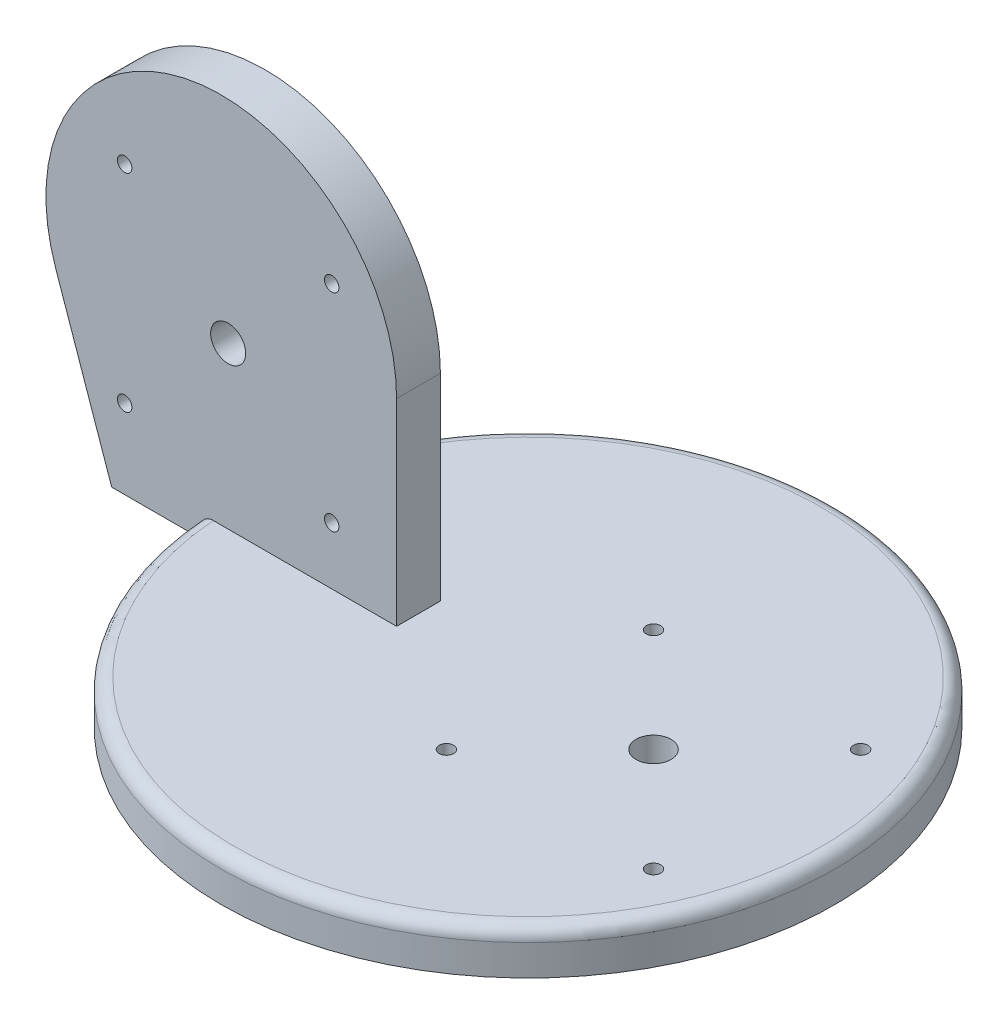
ISO-10303-21;
HEADER;
FILE_DESCRIPTION(('STEP AP214'),'2;1');
FILE_NAME('part.step','',(''),(''),'','','');
FILE_SCHEMA(('AUTOMOTIVE_DESIGN { 1 0 10303 214 1 1 1 1 }'));
ENDSEC;
DATA;
#1=APPLICATION_CONTEXT('core data for automotive mechanical design processes');
#2=APPLICATION_PROTOCOL_DEFINITION('international standard','automotive_design',2000,#1);
#3=PRODUCT_CONTEXT('',#1,'mechanical');
#4=PRODUCT('Part','Part','',(#3));
#5=PRODUCT_RELATED_PRODUCT_CATEGORY('part','',(#4));
#6=PRODUCT_DEFINITION_FORMATION('','',#4);
#7=PRODUCT_DEFINITION_CONTEXT('part definition',#1,'design');
#8=PRODUCT_DEFINITION('design','',#6,#7);
#9=PRODUCT_DEFINITION_SHAPE('','',#8);
#10=(LENGTH_UNIT() NAMED_UNIT(*) SI_UNIT(.MILLI.,.METRE.));
#11=(NAMED_UNIT(*) PLANE_ANGLE_UNIT() SI_UNIT($,.RADIAN.));
#12=(NAMED_UNIT(*) SI_UNIT($,.STERADIAN.) SOLID_ANGLE_UNIT());
#13=UNCERTAINTY_MEASURE_WITH_UNIT(LENGTH_MEASURE(1.E-05),#10,'distance_accuracy_value','');
#14=(GEOMETRIC_REPRESENTATION_CONTEXT(3) GLOBAL_UNCERTAINTY_ASSIGNED_CONTEXT((#13)) GLOBAL_UNIT_ASSIGNED_CONTEXT((#10,
#11,#12)) REPRESENTATION_CONTEXT('',''));
#15=CARTESIAN_POINT('',(0.,0.,0.));
#16=DIRECTION('',(0.,0.,1.));
#17=DIRECTION('',(1.,0.,0.));
#18=AXIS2_PLACEMENT_3D('',#15,#16,#17);
#19=CARTESIAN_POINT('',(0.,10.,0.));
#20=DIRECTION('',(0.,-1.,0.));
#21=DIRECTION('',(0.,0.,-1.));
#22=AXIS2_PLACEMENT_3D('',#19,#20,#21);
#23=CYLINDRICAL_SURFACE('',#22,70.);
#24=CARTESIAN_POINT('',(0.,0.,0.));
#25=DIRECTION('',(0.,1.,0.));
#26=DIRECTION('',(0.,0.,1.));
#27=AXIS2_PLACEMENT_3D('',#24,#25,#26);
#28=CIRCLE('',#27,70.);
#29=CARTESIAN_POINT('',(0.,0.,70.));
#30=VERTEX_POINT('',#29);
#31=EDGE_CURVE('E223',#30,#30,#28,.T.);
#32=ORIENTED_EDGE('',*,*,#31,.T.);
#33=EDGE_LOOP('',(#32));
#34=FACE_BOUND('',#33,.T.);
#35=DIRECTION('',(0.,-1.,0.));
#36=VECTOR('',#35,1.);
#37=CARTESIAN_POINT('',(-69.8212002188447,10.,-5.));
#38=LINE('',#37,#36);
#39=CARTESIAN_POINT('',(-69.8212002188447,4.99999999999999,-5.));
#40=VERTEX_POINT('',#39);
#41=CARTESIAN_POINT('',(-69.8212002188447,7.,-5.));
#42=VERTEX_POINT('',#41);
#43=EDGE_CURVE('E216',#40,#42,#38,.F.);
#44=ORIENTED_EDGE('',*,*,#43,.T.);
#45=CARTESIAN_POINT('',(0.,7.,0.));
#46=DIRECTION('',(0.,1.,0.));
#47=DIRECTION('',(0.,0.,1.));
#48=AXIS2_PLACEMENT_3D('',#45,#46,#47);
#49=CIRCLE('',#48,70.);
#50=CARTESIAN_POINT('',(-69.8212002188447,7.,5.));
#51=VERTEX_POINT('',#50);
#52=EDGE_CURVE('E63',#42,#51,#49,.F.);
#53=ORIENTED_EDGE('',*,*,#52,.T.);
#54=DIRECTION('',(0.,-1.,0.));
#55=VECTOR('',#54,1.);
#56=CARTESIAN_POINT('',(-69.8212002188447,10.,5.));
#57=LINE('',#56,#55);
#58=CARTESIAN_POINT('',(-69.8212002188447,4.99999999999999,5.));
#59=VERTEX_POINT('',#58);
#60=EDGE_CURVE('E218',#59,#51,#57,.F.);
#61=ORIENTED_EDGE('',*,*,#60,.F.);
#62=CARTESIAN_POINT('',(0.,5.,0.));
#63=DIRECTION('',(0.,1.,0.));
#64=DIRECTION('',(-1.,0.,0.));
#65=AXIS2_PLACEMENT_3D('',#62,#63,#64);
#66=CIRCLE('',#65,70.);
#67=EDGE_CURVE('E236',#40,#59,#66,.T.);
#68=ORIENTED_EDGE('',*,*,#67,.F.);
#69=EDGE_LOOP('',(#44,#53,#61,#68));
#70=FACE_BOUND('',#69,.T.);
#71=ADVANCED_FACE('F36',(#34,#70),#23,.T.);
#72=CARTESIAN_POINT('',(0.,10.,0.));
#73=DIRECTION('',(0.,1.,0.));
#74=DIRECTION('',(0.,0.,1.));
#75=AXIS2_PLACEMENT_3D('',#72,#73,#74);
#76=PLANE('',#75);
#77=CARTESIAN_POINT('',(28.624,10.,0.00199999999999853));
#78=DIRECTION('',(0.,1.,0.));
#79=DIRECTION('',(0.,0.,1.));
#80=AXIS2_PLACEMENT_3D('',#77,#78,#79);
#81=CIRCLE('',#80,3.99999999999999);
#82=CARTESIAN_POINT('',(28.624,10.,4.00199999999999));
#83=VERTEX_POINT('',#82);
#84=EDGE_CURVE('E611',#83,#83,#81,.T.);
#85=ORIENTED_EDGE('',*,*,#84,.F.);
#86=EDGE_LOOP('',(#85));
#87=FACE_BOUND('',#86,.T.);
#88=CARTESIAN_POINT('',(5.,10.,-23.622));
#89=DIRECTION('',(0.,1.,0.));
#90=DIRECTION('',(0.,0.,1.));
#91=AXIS2_PLACEMENT_3D('',#88,#89,#90);
#92=CIRCLE('',#91,1.64999999999999);
#93=CARTESIAN_POINT('',(5.,10.,-21.972));
#94=VERTEX_POINT('',#93);
#95=EDGE_CURVE('E163',#94,#94,#92,.T.);
#96=ORIENTED_EDGE('',*,*,#95,.F.);
#97=EDGE_LOOP('',(#96));
#98=FACE_BOUND('',#97,.T.);
#99=CARTESIAN_POINT('',(52.244,10.,-23.622));
#100=DIRECTION('',(0.,1.,0.));
#101=DIRECTION('',(0.,0.,1.));
#102=AXIS2_PLACEMENT_3D('',#99,#100,#101);
#103=CIRCLE('',#102,1.64999999999999);
#104=CARTESIAN_POINT('',(52.244,10.,-21.972));
#105=VERTEX_POINT('',#104);
#106=EDGE_CURVE('E169',#105,#105,#103,.T.);
#107=ORIENTED_EDGE('',*,*,#106,.F.);
#108=EDGE_LOOP('',(#107));
#109=FACE_BOUND('',#108,.T.);
#110=CARTESIAN_POINT('',(52.244,10.,23.622));
#111=DIRECTION('',(0.,1.,0.));
#112=DIRECTION('',(0.,0.,1.));
#113=AXIS2_PLACEMENT_3D('',#110,#111,#112);
#114=CIRCLE('',#113,1.64999999999999);
#115=CARTESIAN_POINT('',(52.244,10.,25.272));
#116=VERTEX_POINT('',#115);
#117=EDGE_CURVE('E175',#116,#116,#114,.T.);
#118=ORIENTED_EDGE('',*,*,#117,.F.);
#119=EDGE_LOOP('',(#118));
#120=FACE_BOUND('',#119,.T.);
#121=CARTESIAN_POINT('',(5.,10.,23.622));
#122=DIRECTION('',(0.,1.,0.));
#123=DIRECTION('',(0.,0.,1.));
#124=AXIS2_PLACEMENT_3D('',#121,#122,#123);
#125=CIRCLE('',#124,1.64999999999999);
#126=CARTESIAN_POINT('',(5.,10.,25.272));
#127=VERTEX_POINT('',#126);
#128=EDGE_CURVE('E181',#127,#127,#125,.T.);
#129=ORIENTED_EDGE('',*,*,#128,.F.);
#130=EDGE_LOOP('',(#129));
#131=FACE_BOUND('',#130,.T.);
#132=DIRECTION('',(-1.,0.,0.));
#133=VECTOR('',#132,1.);
#134=CARTESIAN_POINT('',(0.,10.,5.));
#135=LINE('',#134,#133);
#136=CARTESIAN_POINT('',(-25.,10.,5.));
#137=VERTEX_POINT('',#136);
#138=CARTESIAN_POINT('',(-66.8131723539603,10.,5.));
#139=VERTEX_POINT('',#138);
#140=EDGE_CURVE('E233',#137,#139,#135,.T.);
#141=ORIENTED_EDGE('',*,*,#140,.T.);
#142=CARTESIAN_POINT('',(0.,10.,0.));
#143=DIRECTION('',(0.,1.,0.));
#144=DIRECTION('',(0.,0.,1.));
#145=AXIS2_PLACEMENT_3D('',#142,#143,#144);
#146=CIRCLE('',#145,67.);
#147=CARTESIAN_POINT('',(-66.8131723539603,10.,-5.));
#148=VERTEX_POINT('',#147);
#149=EDGE_CURVE('E239',#139,#148,#146,.T.);
#150=ORIENTED_EDGE('',*,*,#149,.T.);
#151=DIRECTION('',(-1.,0.,0.));
#152=VECTOR('',#151,1.);
#153=CARTESIAN_POINT('',(0.,10.,-5.));
#154=LINE('',#153,#152);
#155=CARTESIAN_POINT('',(-25.,10.,-5.));
#156=VERTEX_POINT('',#155);
#157=EDGE_CURVE('E227',#156,#148,#154,.T.);
#158=ORIENTED_EDGE('',*,*,#157,.F.);
#159=DIRECTION('',(0.,0.,1.));
#160=VECTOR('',#159,1.);
#161=CARTESIAN_POINT('',(-25.,10.,0.));
#162=LINE('',#161,#160);
#163=EDGE_CURVE('E231',#156,#137,#162,.T.);
#164=ORIENTED_EDGE('',*,*,#163,.T.);
#165=EDGE_LOOP('',(#141,#150,#158,#164));
#166=FACE_BOUND('',#165,.T.);
#167=ADVANCED_FACE('F281',(#87,#98,#109,#120,#131,#166),#76,.T.);
#168=CARTESIAN_POINT('',(0.,0.,0.));
#169=DIRECTION('',(0.,1.,0.));
#170=DIRECTION('',(0.,0.,1.));
#171=AXIS2_PLACEMENT_3D('',#168,#169,#170);
#172=PLANE('',#171);
#173=CARTESIAN_POINT('',(0.,0.,0.));
#174=DIRECTION('',(0.,-1.,0.));
#175=DIRECTION('',(0.,0.,-1.));
#176=AXIS2_PLACEMENT_3D('',#173,#174,#175);
#177=CIRCLE('',#176,65.);
#178=CARTESIAN_POINT('',(0.,0.,-65.));
#179=VERTEX_POINT('',#178);
#180=EDGE_CURVE('E224',#179,#179,#177,.T.);
#181=ORIENTED_EDGE('',*,*,#180,.F.);
#182=EDGE_LOOP('',(#181));
#183=FACE_BOUND('',#182,.T.);
#184=ORIENTED_EDGE('',*,*,#31,.F.);
#185=EDGE_LOOP('',(#184));
#186=FACE_BOUND('',#185,.T.);
#187=ADVANCED_FACE('F279',(#183,#186),#172,.F.);
#188=CARTESIAN_POINT('',(0.,-3.,0.));
#189=DIRECTION('',(0.,1.,0.));
#190=DIRECTION('',(0.,0.,1.));
#191=AXIS2_PLACEMENT_3D('',#188,#189,#190);
#192=CYLINDRICAL_SURFACE('',#191,65.);
#193=CARTESIAN_POINT('',(0.,-3.,0.));
#194=DIRECTION('',(0.,-1.,0.));
#195=DIRECTION('',(0.,0.,-1.));
#196=AXIS2_PLACEMENT_3D('',#193,#194,#195);
#197=CIRCLE('',#196,65.);
#198=CARTESIAN_POINT('',(0.,-3.,-65.));
#199=VERTEX_POINT('',#198);
#200=EDGE_CURVE('E220',#199,#199,#197,.T.);
#201=ORIENTED_EDGE('',*,*,#200,.F.);
#202=EDGE_LOOP('',(#201));
#203=FACE_BOUND('',#202,.T.);
#204=ORIENTED_EDGE('',*,*,#180,.T.);
#205=EDGE_LOOP('',(#204));
#206=FACE_BOUND('',#205,.T.);
#207=ADVANCED_FACE('F275',(#203,#206),#192,.T.);
#208=CARTESIAN_POINT('',(0.,-3.,0.));
#209=DIRECTION('',(0.,-1.,0.));
#210=DIRECTION('',(0.,0.,-1.));
#211=AXIS2_PLACEMENT_3D('',#208,#209,#210);
#212=PLANE('',#211);
#213=CARTESIAN_POINT('',(28.624,-3.,0.00199999999999853));
#214=DIRECTION('',(0.,1.,0.));
#215=DIRECTION('',(0.,0.,1.));
#216=AXIS2_PLACEMENT_3D('',#213,#214,#215);
#217=CIRCLE('',#216,4.);
#218=CARTESIAN_POINT('',(28.624,-3.,4.002));
#219=VERTEX_POINT('',#218);
#220=EDGE_CURVE('E139',#219,#219,#217,.T.);
#221=ORIENTED_EDGE('',*,*,#220,.T.);
#222=EDGE_LOOP('',(#221));
#223=FACE_BOUND('',#222,.T.);
#224=ORIENTED_EDGE('',*,*,#200,.T.);
#225=EDGE_LOOP('',(#224));
#226=FACE_BOUND('',#225,.T.);
#227=ADVANCED_FACE('F272',(#223,#226),#212,.T.);
#228=CARTESIAN_POINT('',(-65.,55.,5.));
#229=DIRECTION('',(0.,0.,-1.));
#230=DIRECTION('',(-1.,0.,0.));
#231=AXIS2_PLACEMENT_3D('',#228,#229,#230);
#232=PLANE('',#231);
#233=CARTESIAN_POINT('',(-87.0402855786441,70.3170248741632,5.));
#234=DIRECTION('',(0.,0.,1.));
#235=DIRECTION('',(1.,0.,0.));
#236=AXIS2_PLACEMENT_3D('',#233,#234,#235);
#237=CIRCLE('',#236,1.64999999999998);
#238=CARTESIAN_POINT('',(-85.3902855786441,70.3170248741632,5.));
#239=VERTEX_POINT('',#238);
#240=EDGE_CURVE('E133',#239,#239,#237,.T.);
#241=ORIENTED_EDGE('',*,*,#240,.F.);
#242=EDGE_LOOP('',(#241));
#243=FACE_BOUND('',#242,.T.);
#244=CARTESIAN_POINT('',(-39.8002855786441,70.3170248741632,5.));
#245=DIRECTION('',(0.,0.,1.));
#246=DIRECTION('',(1.,0.,0.));
#247=AXIS2_PLACEMENT_3D('',#244,#245,#246);
#248=CIRCLE('',#247,1.64999999999999);
#249=CARTESIAN_POINT('',(-38.1502855786441,70.3170248741632,5.));
#250=VERTEX_POINT('',#249);
#251=EDGE_CURVE('E132',#250,#250,#248,.T.);
#252=ORIENTED_EDGE('',*,*,#251,.F.);
#253=EDGE_LOOP('',(#252));
#254=FACE_BOUND('',#253,.T.);
#255=CARTESIAN_POINT('',(-39.8002855786441,23.0770248741632,5.));
#256=DIRECTION('',(0.,0.,1.));
#257=DIRECTION('',(1.,0.,0.));
#258=AXIS2_PLACEMENT_3D('',#255,#256,#257);
#259=CIRCLE('',#258,1.64999999999999);
#260=CARTESIAN_POINT('',(-38.1502855786441,23.0770248741632,5.));
#261=VERTEX_POINT('',#260);
#262=EDGE_CURVE('E145',#261,#261,#259,.T.);
#263=ORIENTED_EDGE('',*,*,#262,.F.);
#264=EDGE_LOOP('',(#263));
#265=FACE_BOUND('',#264,.T.);
#266=CARTESIAN_POINT('',(-87.0402855786441,23.0770248741632,5.));
#267=DIRECTION('',(0.,0.,1.));
#268=DIRECTION('',(1.,0.,0.));
#269=AXIS2_PLACEMENT_3D('',#266,#267,#268);
#270=CIRCLE('',#269,1.64999999999998);
#271=CARTESIAN_POINT('',(-85.3902855786441,23.0770248741632,5.));
#272=VERTEX_POINT('',#271);
#273=EDGE_CURVE('E151',#272,#272,#270,.T.);
#274=ORIENTED_EDGE('',*,*,#273,.F.);
#275=EDGE_LOOP('',(#274));
#276=FACE_BOUND('',#275,.T.);
#277=CARTESIAN_POINT('',(-63.4202855786441,46.6970248741632,5.));
#278=DIRECTION('',(0.,0.,-1.));
#279=DIRECTION('',(-1.,0.,0.));
#280=AXIS2_PLACEMENT_3D('',#277,#278,#279);
#281=CIRCLE('',#280,3.99999999999999);
#282=CARTESIAN_POINT('',(-67.4202855786441,46.6970248741632,5.));
#283=VERTEX_POINT('',#282);
#284=EDGE_CURVE('E160',#283,#283,#281,.T.);
#285=ORIENTED_EDGE('',*,*,#284,.T.);
#286=EDGE_LOOP('',(#285));
#287=FACE_BOUND('',#286,.T.);
#288=DIRECTION('',(1.,0.,0.));
#289=VECTOR('',#288,1.);
#290=CARTESIAN_POINT('',(-25.,4.99999999999999,5.));
#291=LINE('',#290,#289);
#292=CARTESIAN_POINT('',(-90.,4.99999999999999,5.));
#293=VERTEX_POINT('',#292);
#294=EDGE_CURVE('E194',#293,#59,#291,.T.);
#295=ORIENTED_EDGE('',*,*,#294,.T.);
#296=ORIENTED_EDGE('',*,*,#60,.T.);
#297=CARTESIAN_POINT('',(-69.8212002188447,7.,5.));
#298=CARTESIAN_POINT('',(-69.8212084342549,7.08422120821764,5.));
#299=CARTESIAN_POINT('',(-69.8176445666124,7.1684385204262,5.));
#300=CARTESIAN_POINT('',(-69.8034362135015,7.33626942209097,5.));
#301=CARTESIAN_POINT('',(-69.7927921023846,7.41988304322969,5.));
#302=CARTESIAN_POINT('',(-69.7644984828856,7.58585112035884,5.));
#303=CARTESIAN_POINT('',(-69.7468547655939,7.6682065589523,5.));
#304=CARTESIAN_POINT('',(-69.7047069072189,7.8311180765593,5.));
#305=CARTESIAN_POINT('',(-69.6802028435003,7.91167417585308,5.));
#306=CARTESIAN_POINT('',(-69.5966030069934,8.149862814264,5.));
#307=CARTESIAN_POINT('',(-69.5274072943705,8.30408740597829,5.));
#308=CARTESIAN_POINT('',(-69.3641784820908,8.59863673369072,5.));
#309=CARTESIAN_POINT('',(-69.2701492676068,8.73896363924809,5.));
#310=CARTESIAN_POINT('',(-69.0597945638039,9.00205220392387,5.));
#311=CARTESIAN_POINT('',(-68.943444869761,9.12479453927964,5.));
#312=CARTESIAN_POINT('',(-68.6918108166636,9.34907894271542,5.));
#313=CARTESIAN_POINT('',(-68.556522683808,9.45061677536978,5.));
#314=CARTESIAN_POINT('',(-68.270509335358,9.62986808274044,5.));
#315=CARTESIAN_POINT('',(-68.1197445799674,9.70751840209134,5.));
#316=CARTESIAN_POINT('',(-67.8073684331959,9.83643772590047,5.));
#317=CARTESIAN_POINT('',(-67.645763015782,9.88772112754761,5.));
#318=CARTESIAN_POINT('',(-67.371540635353,9.95000516458832,5.));
#319=CARTESIAN_POINT('',(-67.2606182921107,9.96874219052413,5.));
#320=CARTESIAN_POINT('',(-67.037536522758,9.99373818095356,5.));
#321=CARTESIAN_POINT('',(-66.9253790797852,10.0000148490537,5.));
#322=CARTESIAN_POINT('',(-66.8131723539603,10.,5.));
#323=B_SPLINE_CURVE_WITH_KNOTS('',3,(#297,#298,#299,#300,#301,#302,#303,#304,#305,#306,#307,
#308,#309,#310,#311,#312,#313,#314,#315,#316,#317,#318,#319,#320,#321,#322),.UNSPECIFIED.,.F.,
.F.,(4,2,2,2,2,2,2,2,2,2,2,2,4),(0.,0.252581239133376,0.505149124679375,0.757508483730531,
1.00986499701836,1.51436249825657,2.01878111814665,2.52374986259712,3.02881937414789,
3.53521296723716,4.0413297586196,4.3781574410262,4.71450621706483),.UNSPECIFIED.);
#324=EDGE_CURVE('E11',#51,#139,#323,.T.);
#325=ORIENTED_EDGE('',*,*,#324,.T.);
#326=ORIENTED_EDGE('',*,*,#140,.F.);
#327=DIRECTION('',(0.,1.,0.));
#328=VECTOR('',#327,1.);
#329=CARTESIAN_POINT('',(-25.,55.,5.));
#330=LINE('',#329,#328);
#331=CARTESIAN_POINT('',(-25.,55.,5.));
#332=VERTEX_POINT('',#331);
#333=EDGE_CURVE('E197',#137,#332,#330,.T.);
#334=ORIENTED_EDGE('',*,*,#333,.T.);
#335=CARTESIAN_POINT('',(-65.,55.,5.));
#336=DIRECTION('',(0.,0.,1.));
#337=DIRECTION('',(-1.,0.,0.));
#338=AXIS2_PLACEMENT_3D('',#335,#336,#337);
#339=CIRCLE('',#338,40.);
#340=CARTESIAN_POINT('',(-102.792798962901,41.8963994814506,5.));
#341=VERTEX_POINT('',#340);
#342=EDGE_CURVE('E188',#332,#341,#339,.T.);
#343=ORIENTED_EDGE('',*,*,#342,.T.);
#344=DIRECTION('',(0.327590012963734,-0.944819974072532,0.));
#345=VECTOR('',#344,1.);
#346=CARTESIAN_POINT('',(-90.,4.99999999999999,5.));
#347=LINE('',#346,#345);
#348=EDGE_CURVE('E191',#341,#293,#347,.T.);
#349=ORIENTED_EDGE('',*,*,#348,.T.);
#350=EDGE_LOOP('',(#295,#296,#325,#326,#334,#343,#349));
#351=FACE_BOUND('',#350,.T.);
#352=ADVANCED_FACE('F252',(#243,#254,#265,#276,#287,#351),#232,.F.);
#353=CARTESIAN_POINT('',(-65.,55.,-5.));
#354=DIRECTION('',(0.,0.,-1.));
#355=DIRECTION('',(-1.,0.,0.));
#356=AXIS2_PLACEMENT_3D('',#353,#354,#355);
#357=PLANE('',#356);
#358=CARTESIAN_POINT('',(-63.4202855786441,46.6970248741632,-5.));
#359=DIRECTION('',(0.,0.,-1.));
#360=DIRECTION('',(-1.,0.,0.));
#361=AXIS2_PLACEMENT_3D('',#358,#359,#360);
#362=CIRCLE('',#361,3.99999999999999);
#363=CARTESIAN_POINT('',(-67.4202855786441,46.6970248741632,-5.));
#364=VERTEX_POINT('',#363);
#365=EDGE_CURVE('E157',#364,#364,#362,.T.);
#366=ORIENTED_EDGE('',*,*,#365,.F.);
#367=EDGE_LOOP('',(#366));
#368=FACE_BOUND('',#367,.T.);
#369=ORIENTED_EDGE('',*,*,#43,.F.);
#370=DIRECTION('',(1.,0.,0.));
#371=VECTOR('',#370,1.);
#372=CARTESIAN_POINT('',(-25.,4.99999999999999,-5.));
#373=LINE('',#372,#371);
#374=CARTESIAN_POINT('',(-90.,4.99999999999999,-5.));
#375=VERTEX_POINT('',#374);
#376=EDGE_CURVE('E204',#375,#40,#373,.T.);
#377=ORIENTED_EDGE('',*,*,#376,.F.);
#378=DIRECTION('',(0.327590012963734,-0.944819974072532,0.));
#379=VECTOR('',#378,1.);
#380=CARTESIAN_POINT('',(-90.,4.99999999999999,-5.));
#381=LINE('',#380,#379);
#382=CARTESIAN_POINT('',(-102.792798962901,41.8963994814506,-5.));
#383=VERTEX_POINT('',#382);
#384=EDGE_CURVE('E202',#383,#375,#381,.T.);
#385=ORIENTED_EDGE('',*,*,#384,.F.);
#386=CARTESIAN_POINT('',(-65.,55.,-5.));
#387=DIRECTION('',(0.,0.,1.));
#388=DIRECTION('',(-1.,0.,0.));
#389=AXIS2_PLACEMENT_3D('',#386,#387,#388);
#390=CIRCLE('',#389,40.);
#391=CARTESIAN_POINT('',(-25.,55.,-5.));
#392=VERTEX_POINT('',#391);
#393=EDGE_CURVE('E187',#392,#383,#390,.T.);
#394=ORIENTED_EDGE('',*,*,#393,.F.);
#395=DIRECTION('',(0.,1.,0.));
#396=VECTOR('',#395,1.);
#397=CARTESIAN_POINT('',(-25.,55.,-5.));
#398=LINE('',#397,#396);
#399=EDGE_CURVE('E192',#156,#392,#398,.T.);
#400=ORIENTED_EDGE('',*,*,#399,.F.);
#401=ORIENTED_EDGE('',*,*,#157,.T.);
#402=CARTESIAN_POINT('',(-66.8131723539603,10.,-5.));
#403=CARTESIAN_POINT('',(-66.8979472090901,10.0000079608505,-5.));
#404=CARTESIAN_POINT('',(-66.9827183350689,9.99642664505652,-5.));
#405=CARTESIAN_POINT('',(-67.1516555895154,9.98214661865629,-5.));
#406=CARTESIAN_POINT('',(-67.235821742884,9.97144820270648,-5.));
#407=CARTESIAN_POINT('',(-67.4029023917693,9.94300469899982,-5.));
#408=CARTESIAN_POINT('',(-67.4858176914904,9.92526435825033,-5.));
#409=CARTESIAN_POINT('',(-67.6498390537472,9.88287845595701,-5.));
#410=CARTESIAN_POINT('',(-67.7309451408285,9.85823298815658,-5.));
#411=CARTESIAN_POINT('',(-67.9707715010503,9.77413166932099,-5.));
#412=CARTESIAN_POINT('',(-68.1260623072656,9.70450022194034,-5.));
#413=CARTESIAN_POINT('',(-68.4226111432586,9.54016784112219,-5.));
#414=CARTESIAN_POINT('',(-68.5638719832425,9.44547194208437,-5.));
#415=CARTESIAN_POINT('',(-68.8282863711961,9.23378792848062,-5.));
#416=CARTESIAN_POINT('',(-68.9514639113918,9.11682983275897,-5.));
#417=CARTESIAN_POINT('',(-69.1763930555414,8.86382096290399,-5.));
#418=CARTESIAN_POINT('',(-69.2781405617235,8.72776654551575,-5.));
#419=CARTESIAN_POINT('',(-69.4570370900423,8.44080697389974,-5.));
#420=CARTESIAN_POINT('',(-69.5342432698226,8.28993741446326,-5.));
#421=CARTESIAN_POINT('',(-69.6621227261444,7.97738913394282,-5.));
#422=CARTESIAN_POINT('',(-69.712812521493,7.81571721333328,-5.));
#423=CARTESIAN_POINT('',(-69.7733449091673,7.54417781800041,-5.));
#424=CARTESIAN_POINT('',(-69.7912798935153,7.43604579606129,-5.));
#425=CARTESIAN_POINT('',(-69.8152057318516,7.21862459434727,-5.));
#426=CARTESIAN_POINT('',(-69.8212135599437,7.10933728188276,-5.));
#427=CARTESIAN_POINT('',(-69.8212002188447,7.,-5.));
#428=B_SPLINE_CURVE_WITH_KNOTS('',3,(#402,#403,#404,#405,#406,#407,#408,#409,#410,#411,#412,
#413,#414,#415,#416,#417,#418,#419,#420,#421,#422,#423,#424,#425,#426,#427),.UNSPECIFIED.,.F.,
.F.,(4,2,2,2,2,2,2,2,2,2,2,2,4),(0.,0.254242185624388,0.508473845972383,0.762534417356176,
1.01659153980281,1.52451815534165,2.03234282699257,2.5394875262415,3.04672911196216,
3.55278050726633,4.0585162731707,4.38673328446741,4.71448285870796),.UNSPECIFIED.);
#429=EDGE_CURVE('E50',#148,#42,#428,.T.);
#430=ORIENTED_EDGE('',*,*,#429,.T.);
#431=EDGE_LOOP('',(#369,#377,#385,#394,#400,#401,#430));
#432=FACE_BOUND('',#431,.T.);
#433=ADVANCED_FACE('F247',(#368,#432),#357,.T.);
#434=CARTESIAN_POINT('',(-65.,55.,5.));
#435=DIRECTION('',(0.,0.,-1.));
#436=DIRECTION('',(-1.,0.,0.));
#437=AXIS2_PLACEMENT_3D('',#434,#435,#436);
#438=CYLINDRICAL_SURFACE('',#437,40.);
#439=ORIENTED_EDGE('',*,*,#393,.T.);
#440=DIRECTION('',(0.,0.,-1.));
#441=VECTOR('',#440,1.);
#442=CARTESIAN_POINT('',(-102.792798962901,41.8963994814506,5.));
#443=LINE('',#442,#441);
#444=EDGE_CURVE('E213',#341,#383,#443,.T.);
#445=ORIENTED_EDGE('',*,*,#444,.F.);
#446=ORIENTED_EDGE('',*,*,#342,.F.);
#447=DIRECTION('',(0.,0.,-1.));
#448=VECTOR('',#447,1.);
#449=CARTESIAN_POINT('',(-25.,55.,5.));
#450=LINE('',#449,#448);
#451=EDGE_CURVE('E199',#332,#392,#450,.T.);
#452=ORIENTED_EDGE('',*,*,#451,.T.);
#453=EDGE_LOOP('',(#439,#445,#446,#452));
#454=FACE_BOUND('',#453,.T.);
#455=ADVANCED_FACE('F251',(#454),#438,.T.);
#456=CARTESIAN_POINT('',(-90.,4.99999999999999,5.));
#457=DIRECTION('',(0.944819974072532,0.327590012963734,0.));
#458=DIRECTION('',(-0.327590012963734,0.944819974072532,0.));
#459=AXIS2_PLACEMENT_3D('',#456,#457,#458);
#460=PLANE('',#459);
#461=ORIENTED_EDGE('',*,*,#384,.T.);
#462=DIRECTION('',(0.,0.,-1.));
#463=VECTOR('',#462,1.);
#464=CARTESIAN_POINT('',(-90.,4.99999999999999,5.));
#465=LINE('',#464,#463);
#466=EDGE_CURVE('E210',#293,#375,#465,.T.);
#467=ORIENTED_EDGE('',*,*,#466,.F.);
#468=ORIENTED_EDGE('',*,*,#348,.F.);
#469=ORIENTED_EDGE('',*,*,#444,.T.);
#470=EDGE_LOOP('',(#461,#467,#468,#469));
#471=FACE_BOUND('',#470,.T.);
#472=ADVANCED_FACE('F264',(#471),#460,.F.);
#473=CARTESIAN_POINT('',(-25.,4.99999999999999,5.));
#474=DIRECTION('',(0.,1.,0.));
#475=DIRECTION('',(-1.,0.,0.));
#476=AXIS2_PLACEMENT_3D('',#473,#474,#475);
#477=PLANE('',#476);
#478=ORIENTED_EDGE('',*,*,#376,.T.);
#479=ORIENTED_EDGE('',*,*,#67,.T.);
#480=ORIENTED_EDGE('',*,*,#294,.F.);
#481=ORIENTED_EDGE('',*,*,#466,.T.);
#482=EDGE_LOOP('',(#478,#479,#480,#481));
#483=FACE_BOUND('',#482,.T.);
#484=ADVANCED_FACE('F260',(#483),#477,.F.);
#485=CARTESIAN_POINT('',(-25.,55.,5.));
#486=DIRECTION('',(-1.,0.,0.));
#487=DIRECTION('',(0.,-1.,0.));
#488=AXIS2_PLACEMENT_3D('',#485,#486,#487);
#489=PLANE('',#488);
#490=ORIENTED_EDGE('',*,*,#163,.F.);
#491=ORIENTED_EDGE('',*,*,#399,.T.);
#492=ORIENTED_EDGE('',*,*,#451,.F.);
#493=ORIENTED_EDGE('',*,*,#333,.F.);
#494=EDGE_LOOP('',(#490,#491,#492,#493));
#495=FACE_BOUND('',#494,.T.);
#496=ADVANCED_FACE('F256',(#495),#489,.F.);
#497=CARTESIAN_POINT('',(5.,4.,23.622));
#498=DIRECTION('',(0.,1.,0.));
#499=DIRECTION('',(0.,0.,1.));
#500=AXIS2_PLACEMENT_3D('',#497,#498,#499);
#501=CONICAL_SURFACE('',#500,1.65,1.02974425867665);
#502=CARTESIAN_POINT('',(5.,3.00857997860453,23.622));
#503=VERTEX_POINT('',#502);
#504=VERTEX_LOOP('',#503);
#505=FACE_BOUND('',#504,.T.);
#506=CARTESIAN_POINT('',(5.,4.,23.622));
#507=DIRECTION('',(0.,1.,0.));
#508=DIRECTION('',(0.,0.,1.));
#509=AXIS2_PLACEMENT_3D('',#506,#507,#508);
#510=CIRCLE('',#509,1.65);
#511=CARTESIAN_POINT('',(5.,4.,25.272));
#512=VERTEX_POINT('',#511);
#513=EDGE_CURVE('E184',#512,#512,#510,.T.);
#514=ORIENTED_EDGE('',*,*,#513,.T.);
#515=EDGE_LOOP('',(#514));
#516=FACE_BOUND('',#515,.T.);
#517=ADVANCED_FACE('F259',(#505,#516),#501,.F.);
#518=CARTESIAN_POINT('',(5.,10.,23.622));
#519=DIRECTION('',(0.,1.,0.));
#520=DIRECTION('',(0.,0.,1.));
#521=AXIS2_PLACEMENT_3D('',#518,#519,#520);
#522=CYLINDRICAL_SURFACE('',#521,1.64999999999999);
#523=ORIENTED_EDGE('',*,*,#513,.F.);
#524=EDGE_LOOP('',(#523));
#525=FACE_BOUND('',#524,.T.);
#526=ORIENTED_EDGE('',*,*,#128,.T.);
#527=EDGE_LOOP('',(#526));
#528=FACE_BOUND('',#527,.T.);
#529=ADVANCED_FACE('F358',(#525,#528),#522,.F.);
#530=CARTESIAN_POINT('',(52.244,4.,23.622));
#531=DIRECTION('',(0.,1.,0.));
#532=DIRECTION('',(0.,0.,1.));
#533=AXIS2_PLACEMENT_3D('',#530,#531,#532);
#534=CONICAL_SURFACE('',#533,1.65,1.02974425867665);
#535=CARTESIAN_POINT('',(52.244,3.00857997860453,23.622));
#536=VERTEX_POINT('',#535);
#537=VERTEX_LOOP('',#536);
#538=FACE_BOUND('',#537,.T.);
#539=CARTESIAN_POINT('',(52.244,4.,23.622));
#540=DIRECTION('',(0.,1.,0.));
#541=DIRECTION('',(0.,0.,1.));
#542=AXIS2_PLACEMENT_3D('',#539,#540,#541);
#543=CIRCLE('',#542,1.65);
#544=CARTESIAN_POINT('',(52.244,4.,25.272));
#545=VERTEX_POINT('',#544);
#546=EDGE_CURVE('E178',#545,#545,#543,.T.);
#547=ORIENTED_EDGE('',*,*,#546,.T.);
#548=EDGE_LOOP('',(#547));
#549=FACE_BOUND('',#548,.T.);
#550=ADVANCED_FACE('F354',(#538,#549),#534,.F.);
#551=CARTESIAN_POINT('',(52.244,10.,23.622));
#552=DIRECTION('',(0.,1.,0.));
#553=DIRECTION('',(0.,0.,1.));
#554=AXIS2_PLACEMENT_3D('',#551,#552,#553);
#555=CYLINDRICAL_SURFACE('',#554,1.65);
#556=ORIENTED_EDGE('',*,*,#546,.F.);
#557=EDGE_LOOP('',(#556));
#558=FACE_BOUND('',#557,.T.);
#559=ORIENTED_EDGE('',*,*,#117,.T.);
#560=EDGE_LOOP('',(#559));
#561=FACE_BOUND('',#560,.T.);
#562=ADVANCED_FACE('F350',(#558,#561),#555,.F.);
#563=CARTESIAN_POINT('',(52.244,4.,-23.622));
#564=DIRECTION('',(0.,1.,0.));
#565=DIRECTION('',(0.,0.,1.));
#566=AXIS2_PLACEMENT_3D('',#563,#564,#565);
#567=CONICAL_SURFACE('',#566,1.65,1.02974425867665);
#568=CARTESIAN_POINT('',(52.244,3.00857997860453,-23.622));
#569=VERTEX_POINT('',#568);
#570=VERTEX_LOOP('',#569);
#571=FACE_BOUND('',#570,.T.);
#572=CARTESIAN_POINT('',(52.244,4.,-23.622));
#573=DIRECTION('',(0.,1.,0.));
#574=DIRECTION('',(0.,0.,1.));
#575=AXIS2_PLACEMENT_3D('',#572,#573,#574);
#576=CIRCLE('',#575,1.65);
#577=CARTESIAN_POINT('',(52.244,4.,-21.972));
#578=VERTEX_POINT('',#577);
#579=EDGE_CURVE('E172',#578,#578,#576,.T.);
#580=ORIENTED_EDGE('',*,*,#579,.T.);
#581=EDGE_LOOP('',(#580));
#582=FACE_BOUND('',#581,.T.);
#583=ADVANCED_FACE('F346',(#571,#582),#567,.F.);
#584=CARTESIAN_POINT('',(52.244,10.,-23.622));
#585=DIRECTION('',(0.,1.,0.));
#586=DIRECTION('',(0.,0.,1.));
#587=AXIS2_PLACEMENT_3D('',#584,#585,#586);
#588=CYLINDRICAL_SURFACE('',#587,1.65);
#589=ORIENTED_EDGE('',*,*,#579,.F.);
#590=EDGE_LOOP('',(#589));
#591=FACE_BOUND('',#590,.T.);
#592=ORIENTED_EDGE('',*,*,#106,.T.);
#593=EDGE_LOOP('',(#592));
#594=FACE_BOUND('',#593,.T.);
#595=ADVANCED_FACE('F342',(#591,#594),#588,.F.);
#596=CARTESIAN_POINT('',(5.,4.,-23.622));
#597=DIRECTION('',(0.,1.,0.));
#598=DIRECTION('',(0.,0.,1.));
#599=AXIS2_PLACEMENT_3D('',#596,#597,#598);
#600=CONICAL_SURFACE('',#599,1.65,1.02974425867665);
#601=CARTESIAN_POINT('',(5.,3.00857997860453,-23.622));
#602=VERTEX_POINT('',#601);
#603=VERTEX_LOOP('',#602);
#604=FACE_BOUND('',#603,.T.);
#605=CARTESIAN_POINT('',(5.,4.,-23.622));
#606=DIRECTION('',(0.,1.,0.));
#607=DIRECTION('',(0.,0.,1.));
#608=AXIS2_PLACEMENT_3D('',#605,#606,#607);
#609=CIRCLE('',#608,1.65);
#610=CARTESIAN_POINT('',(5.,4.,-21.972));
#611=VERTEX_POINT('',#610);
#612=EDGE_CURVE('E166',#611,#611,#609,.T.);
#613=ORIENTED_EDGE('',*,*,#612,.T.);
#614=EDGE_LOOP('',(#613));
#615=FACE_BOUND('',#614,.T.);
#616=ADVANCED_FACE('F335',(#604,#615),#600,.F.);
#617=CARTESIAN_POINT('',(5.,10.,-23.622));
#618=DIRECTION('',(0.,1.,0.));
#619=DIRECTION('',(0.,0.,1.));
#620=AXIS2_PLACEMENT_3D('',#617,#618,#619);
#621=CYLINDRICAL_SURFACE('',#620,1.64999999999999);
#622=ORIENTED_EDGE('',*,*,#612,.F.);
#623=EDGE_LOOP('',(#622));
#624=FACE_BOUND('',#623,.T.);
#625=ORIENTED_EDGE('',*,*,#95,.T.);
#626=EDGE_LOOP('',(#625));
#627=FACE_BOUND('',#626,.T.);
#628=ADVANCED_FACE('F325',(#624,#627),#621,.F.);
#629=CARTESIAN_POINT('',(-63.4202855786441,46.6970248741632,-5.));
#630=DIRECTION('',(0.,0.,-1.));
#631=DIRECTION('',(-1.,0.,0.));
#632=AXIS2_PLACEMENT_3D('',#629,#630,#631);
#633=CYLINDRICAL_SURFACE('',#632,3.99999999999999);
#634=ORIENTED_EDGE('',*,*,#365,.T.);
#635=EDGE_LOOP('',(#634));
#636=FACE_BOUND('',#635,.T.);
#637=ORIENTED_EDGE('',*,*,#284,.F.);
#638=EDGE_LOOP('',(#637));
#639=FACE_BOUND('',#638,.T.);
#640=ADVANCED_FACE('F322',(#636,#639),#633,.F.);
#641=CARTESIAN_POINT('',(-87.0402855786441,23.0770248741632,-0.999999999999999));
#642=DIRECTION('',(0.,0.,1.));
#643=DIRECTION('',(1.,0.,0.));
#644=AXIS2_PLACEMENT_3D('',#641,#642,#643);
#645=CONICAL_SURFACE('',#644,1.65,1.02974425867665);
#646=CARTESIAN_POINT('',(-87.0402855786441,23.0770248741632,-1.99142002139547));
#647=VERTEX_POINT('',#646);
#648=VERTEX_LOOP('',#647);
#649=FACE_BOUND('',#648,.T.);
#650=CARTESIAN_POINT('',(-87.0402855786441,23.0770248741632,-0.999999999999999));
#651=DIRECTION('',(0.,0.,1.));
#652=DIRECTION('',(1.,0.,0.));
#653=AXIS2_PLACEMENT_3D('',#650,#651,#652);
#654=CIRCLE('',#653,1.65);
#655=CARTESIAN_POINT('',(-85.3902855786441,23.0770248741632,-0.999999999999999));
#656=VERTEX_POINT('',#655);
#657=EDGE_CURVE('E154',#656,#656,#654,.T.);
#658=ORIENTED_EDGE('',*,*,#657,.T.);
#659=EDGE_LOOP('',(#658));
#660=FACE_BOUND('',#659,.T.);
#661=ADVANCED_FACE('F324',(#649,#660),#645,.F.);
#662=CARTESIAN_POINT('',(-87.0402855786441,23.0770248741632,5.));
#663=DIRECTION('',(0.,0.,1.));
#664=DIRECTION('',(1.,0.,0.));
#665=AXIS2_PLACEMENT_3D('',#662,#663,#664);
#666=CYLINDRICAL_SURFACE('',#665,1.64999999999999);
#667=ORIENTED_EDGE('',*,*,#657,.F.);
#668=EDGE_LOOP('',(#667));
#669=FACE_BOUND('',#668,.T.);
#670=ORIENTED_EDGE('',*,*,#273,.T.);
#671=EDGE_LOOP('',(#670));
#672=FACE_BOUND('',#671,.T.);
#673=ADVANCED_FACE('F332',(#669,#672),#666,.F.);
#674=CARTESIAN_POINT('',(-39.8002855786441,23.0770248741632,-0.999999999999999));
#675=DIRECTION('',(0.,0.,1.));
#676=DIRECTION('',(1.,0.,0.));
#677=AXIS2_PLACEMENT_3D('',#674,#675,#676);
#678=CONICAL_SURFACE('',#677,1.65,1.02974425867665);
#679=CARTESIAN_POINT('',(-39.8002855786441,23.0770248741632,-1.99142002139547));
#680=VERTEX_POINT('',#679);
#681=VERTEX_LOOP('',#680);
#682=FACE_BOUND('',#681,.T.);
#683=CARTESIAN_POINT('',(-39.8002855786441,23.0770248741632,-0.999999999999999));
#684=DIRECTION('',(0.,0.,1.));
#685=DIRECTION('',(1.,0.,0.));
#686=AXIS2_PLACEMENT_3D('',#683,#684,#685);
#687=CIRCLE('',#686,1.65);
#688=CARTESIAN_POINT('',(-38.1502855786441,23.0770248741632,-0.999999999999999));
#689=VERTEX_POINT('',#688);
#690=EDGE_CURVE('E148',#689,#689,#687,.T.);
#691=ORIENTED_EDGE('',*,*,#690,.T.);
#692=EDGE_LOOP('',(#691));
#693=FACE_BOUND('',#692,.T.);
#694=ADVANCED_FACE('F414',(#682,#693),#678,.F.);
#695=CARTESIAN_POINT('',(-39.8002855786441,23.0770248741632,5.));
#696=DIRECTION('',(0.,0.,1.));
#697=DIRECTION('',(1.,0.,0.));
#698=AXIS2_PLACEMENT_3D('',#695,#696,#697);
#699=CYLINDRICAL_SURFACE('',#698,1.65);
#700=ORIENTED_EDGE('',*,*,#690,.F.);
#701=EDGE_LOOP('',(#700));
#702=FACE_BOUND('',#701,.T.);
#703=ORIENTED_EDGE('',*,*,#262,.T.);
#704=EDGE_LOOP('',(#703));
#705=FACE_BOUND('',#704,.T.);
#706=ADVANCED_FACE('F421',(#702,#705),#699,.F.);
#707=CARTESIAN_POINT('',(-39.8002855786441,70.3170248741632,-0.999999999999999));
#708=DIRECTION('',(0.,0.,1.));
#709=DIRECTION('',(1.,0.,0.));
#710=AXIS2_PLACEMENT_3D('',#707,#708,#709);
#711=CONICAL_SURFACE('',#710,1.65,1.02974425867665);
#712=CARTESIAN_POINT('',(-39.8002855786441,70.3170248741632,-1.99142002139547));
#713=VERTEX_POINT('',#712);
#714=VERTEX_LOOP('',#713);
#715=FACE_BOUND('',#714,.T.);
#716=CARTESIAN_POINT('',(-39.8002855786441,70.3170248741632,-0.999999999999999));
#717=DIRECTION('',(0.,0.,1.));
#718=DIRECTION('',(1.,0.,0.));
#719=AXIS2_PLACEMENT_3D('',#716,#717,#718);
#720=CIRCLE('',#719,1.65);
#721=CARTESIAN_POINT('',(-38.1502855786441,70.3170248741632,-0.999999999999999));
#722=VERTEX_POINT('',#721);
#723=EDGE_CURVE('E136',#722,#722,#720,.T.);
#724=ORIENTED_EDGE('',*,*,#723,.T.);
#725=EDGE_LOOP('',(#724));
#726=FACE_BOUND('',#725,.T.);
#727=ADVANCED_FACE('F425',(#715,#726),#711,.F.);
#728=CARTESIAN_POINT('',(-39.8002855786441,70.3170248741632,5.));
#729=DIRECTION('',(0.,0.,1.));
#730=DIRECTION('',(1.,0.,0.));
#731=AXIS2_PLACEMENT_3D('',#728,#729,#730);
#732=CYLINDRICAL_SURFACE('',#731,1.65);
#733=ORIENTED_EDGE('',*,*,#723,.F.);
#734=EDGE_LOOP('',(#733));
#735=FACE_BOUND('',#734,.T.);
#736=ORIENTED_EDGE('',*,*,#251,.T.);
#737=EDGE_LOOP('',(#736));
#738=FACE_BOUND('',#737,.T.);
#739=ADVANCED_FACE('F126',(#735,#738),#732,.F.);
#740=CARTESIAN_POINT('',(-87.0402855786441,70.3170248741632,-0.999999999999999));
#741=DIRECTION('',(0.,0.,1.));
#742=DIRECTION('',(1.,0.,0.));
#743=AXIS2_PLACEMENT_3D('',#740,#741,#742);
#744=CONICAL_SURFACE('',#743,1.65,1.02974425867665);
#745=CARTESIAN_POINT('',(-87.0402855786441,70.3170248741632,-1.99142002139547));
#746=VERTEX_POINT('',#745);
#747=VERTEX_LOOP('',#746);
#748=FACE_BOUND('',#747,.T.);
#749=CARTESIAN_POINT('',(-87.0402855786441,70.3170248741632,-0.999999999999999));
#750=DIRECTION('',(0.,0.,1.));
#751=DIRECTION('',(1.,0.,0.));
#752=AXIS2_PLACEMENT_3D('',#749,#750,#751);
#753=CIRCLE('',#752,1.65);
#754=CARTESIAN_POINT('',(-85.3902855786441,70.3170248741632,-0.999999999999999));
#755=VERTEX_POINT('',#754);
#756=EDGE_CURVE('E130',#755,#755,#753,.T.);
#757=ORIENTED_EDGE('',*,*,#756,.T.);
#758=EDGE_LOOP('',(#757));
#759=FACE_BOUND('',#758,.T.);
#760=ADVANCED_FACE('F122',(#748,#759),#744,.F.);
#761=CARTESIAN_POINT('',(-87.0402855786441,70.3170248741632,5.));
#762=DIRECTION('',(0.,0.,1.));
#763=DIRECTION('',(1.,0.,0.));
#764=AXIS2_PLACEMENT_3D('',#761,#762,#763);
#765=CYLINDRICAL_SURFACE('',#764,1.64999999999999);
#766=ORIENTED_EDGE('',*,*,#756,.F.);
#767=EDGE_LOOP('',(#766));
#768=FACE_BOUND('',#767,.T.);
#769=ORIENTED_EDGE('',*,*,#240,.T.);
#770=EDGE_LOOP('',(#769));
#771=FACE_BOUND('',#770,.T.);
#772=ADVANCED_FACE('F125',(#768,#771),#765,.F.);
#773=CARTESIAN_POINT('',(28.624,10.,0.00199999999999853));
#774=DIRECTION('',(0.,1.,0.));
#775=DIRECTION('',(0.,0.,1.));
#776=AXIS2_PLACEMENT_3D('',#773,#774,#775);
#777=CYLINDRICAL_SURFACE('',#776,3.99999999999999);
#778=ORIENTED_EDGE('',*,*,#220,.F.);
#779=EDGE_LOOP('',(#778));
#780=FACE_BOUND('',#779,.T.);
#781=ORIENTED_EDGE('',*,*,#84,.T.);
#782=EDGE_LOOP('',(#781));
#783=FACE_BOUND('',#782,.T.);
#784=ADVANCED_FACE('F444',(#780,#783),#777,.F.);
#785=CARTESIAN_POINT('',(0.,7.,0.));
#786=DIRECTION('',(0.,1.,0.));
#787=DIRECTION('',(0.,0.,1.));
#788=AXIS2_PLACEMENT_3D('',#785,#786,#787);
#789=TOROIDAL_SURFACE('',#788,67.,3.);
#790=ORIENTED_EDGE('',*,*,#324,.F.);
#791=ORIENTED_EDGE('',*,*,#52,.F.);
#792=ORIENTED_EDGE('',*,*,#429,.F.);
#793=ORIENTED_EDGE('',*,*,#149,.F.);
#794=EDGE_LOOP('',(#790,#791,#792,#793));
#795=FACE_BOUND('',#794,.T.);
#796=ADVANCED_FACE('F38',(#795),#789,.T.);
#797=CLOSED_SHELL('',(#71,#167,#187,#207,#227,#352,#433,#455,#472,#484,#496,#517,#529,#550,#562,
#583,#595,#616,#628,#640,#661,#673,#694,#706,#727,#739,#760,#772,#784,#796));
#798=MANIFOLD_SOLID_BREP('B2',#797);
#799=ADVANCED_BREP_SHAPE_REPRESENTATION('',(#18,#798),#14);
#800=SHAPE_DEFINITION_REPRESENTATION(#9,#799);
ENDSEC;
END-ISO-10303-21;
